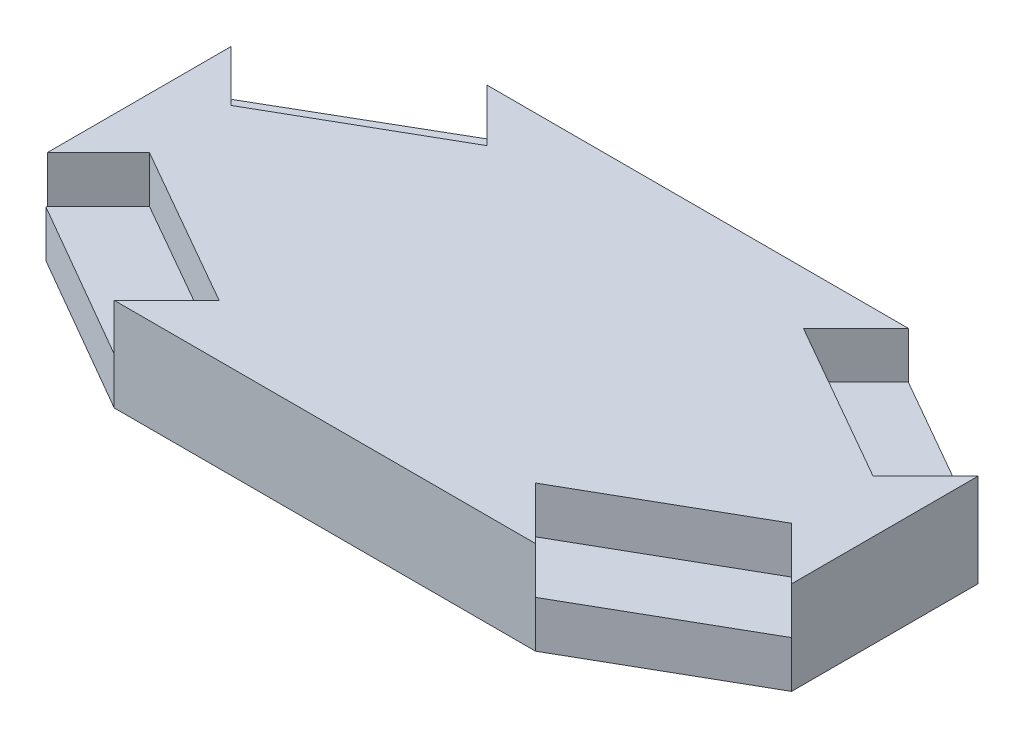
ISO-10303-21;
HEADER;
FILE_DESCRIPTION(('STEP AP214'),'2;1');
FILE_NAME('part.step','',(''),(''),'','','');
FILE_SCHEMA(('AUTOMOTIVE_DESIGN { 1 0 10303 214 1 1 1 1 }'));
ENDSEC;
DATA;
#1=APPLICATION_CONTEXT('core data for automotive mechanical design processes');
#2=APPLICATION_PROTOCOL_DEFINITION('international standard','automotive_design',2000,#1);
#3=PRODUCT_CONTEXT('',#1,'mechanical');
#4=PRODUCT('Part','Part','',(#3));
#5=PRODUCT_RELATED_PRODUCT_CATEGORY('part','',(#4));
#6=PRODUCT_DEFINITION_FORMATION('','',#4);
#7=PRODUCT_DEFINITION_CONTEXT('part definition',#1,'design');
#8=PRODUCT_DEFINITION('design','',#6,#7);
#9=PRODUCT_DEFINITION_SHAPE('','',#8);
#10=(LENGTH_UNIT() NAMED_UNIT(*) SI_UNIT(.MILLI.,.METRE.));
#11=(NAMED_UNIT(*) PLANE_ANGLE_UNIT() SI_UNIT($,.RADIAN.));
#12=(NAMED_UNIT(*) SI_UNIT($,.STERADIAN.) SOLID_ANGLE_UNIT());
#13=UNCERTAINTY_MEASURE_WITH_UNIT(LENGTH_MEASURE(1.E-05),#10,'distance_accuracy_value','');
#14=(GEOMETRIC_REPRESENTATION_CONTEXT(3) GLOBAL_UNCERTAINTY_ASSIGNED_CONTEXT((#13)) GLOBAL_UNIT_ASSIGNED_CONTEXT((#10,
#11,#12)) REPRESENTATION_CONTEXT('',''));
#15=CARTESIAN_POINT('',(0.,0.,0.));
#16=DIRECTION('',(0.,0.,1.));
#17=DIRECTION('',(1.,0.,0.));
#18=AXIS2_PLACEMENT_3D('',#15,#16,#17);
#19=CARTESIAN_POINT('',(50.8,6.35,6.35));
#20=DIRECTION('',(-0.496577563962219,0.,-0.867992351907175));
#21=DIRECTION('',(-0.867992351907175,0.,0.496577563962219));
#22=AXIS2_PLACEMENT_3D('',#19,#20,#21);
#23=PLANE('',#22);
#24=DIRECTION('',(0.867992351907175,0.,-0.496577563962219));
#25=VECTOR('',#24,1.);
#26=CARTESIAN_POINT('',(39.7005226280624,3.175,12.7));
#27=LINE('',#26,#25);
#28=CARTESIAN_POINT('',(39.7005226280624,3.175,12.7));
#29=VERTEX_POINT('',#28);
#30=CARTESIAN_POINT('',(50.8,3.175,6.35));
#31=VERTEX_POINT('',#30);
#32=EDGE_CURVE('E257',#29,#31,#27,.T.);
#33=ORIENTED_EDGE('',*,*,#32,.F.);
#34=DIRECTION('',(0.,-1.,0.));
#35=VECTOR('',#34,1.);
#36=CARTESIAN_POINT('',(39.7005226280624,6.35,12.7));
#37=LINE('',#36,#35);
#38=CARTESIAN_POINT('',(39.7005226280624,0.,12.7));
#39=VERTEX_POINT('',#38);
#40=EDGE_CURVE('E345',#29,#39,#37,.T.);
#41=ORIENTED_EDGE('',*,*,#40,.T.);
#42=DIRECTION('',(0.867992351907175,0.,-0.496577563962219));
#43=VECTOR('',#42,1.);
#44=CARTESIAN_POINT('',(50.8,0.,6.35));
#45=LINE('',#44,#43);
#46=CARTESIAN_POINT('',(50.8,0.,6.35));
#47=VERTEX_POINT('',#46);
#48=EDGE_CURVE('E303',#39,#47,#45,.T.);
#49=ORIENTED_EDGE('',*,*,#48,.T.);
#50=DIRECTION('',(0.,-1.,0.));
#51=VECTOR('',#50,1.);
#52=CARTESIAN_POINT('',(50.8,6.35,6.35));
#53=LINE('',#52,#51);
#54=EDGE_CURVE('E336',#31,#47,#53,.T.);
#55=ORIENTED_EDGE('',*,*,#54,.F.);
#56=EDGE_LOOP('',(#33,#41,#49,#55));
#57=FACE_BOUND('',#56,.T.);
#58=ADVANCED_FACE('F39',(#57),#23,.F.);
#59=CARTESIAN_POINT('',(50.8,6.35,-6.35));
#60=DIRECTION('',(-0.496577563962219,0.,0.867992351907175));
#61=DIRECTION('',(0.867992351907175,0.,0.496577563962219));
#62=AXIS2_PLACEMENT_3D('',#59,#60,#61);
#63=PLANE('',#62);
#64=DIRECTION('',(-0.867992351907175,0.,-0.496577563962219));
#65=VECTOR('',#64,1.);
#66=CARTESIAN_POINT('',(39.7005226280624,3.175,-12.7));
#67=LINE('',#66,#65);
#68=CARTESIAN_POINT('',(50.8,3.175,-6.35));
#69=VERTEX_POINT('',#68);
#70=CARTESIAN_POINT('',(39.7005226280624,3.175,-12.7));
#71=VERTEX_POINT('',#70);
#72=EDGE_CURVE('E241',#69,#71,#67,.T.);
#73=ORIENTED_EDGE('',*,*,#72,.F.);
#74=DIRECTION('',(0.,-1.,0.));
#75=VECTOR('',#74,1.);
#76=CARTESIAN_POINT('',(50.8,6.35,-6.35));
#77=LINE('',#76,#75);
#78=CARTESIAN_POINT('',(50.8,0.,-6.35));
#79=VERTEX_POINT('',#78);
#80=EDGE_CURVE('E333',#69,#79,#77,.T.);
#81=ORIENTED_EDGE('',*,*,#80,.T.);
#82=DIRECTION('',(-0.867992351907175,0.,-0.496577563962219));
#83=VECTOR('',#82,1.);
#84=CARTESIAN_POINT('',(50.8,0.,-6.35));
#85=LINE('',#84,#83);
#86=CARTESIAN_POINT('',(39.7005226280624,0.,-12.7));
#87=VERTEX_POINT('',#86);
#88=EDGE_CURVE('E307',#79,#87,#85,.T.);
#89=ORIENTED_EDGE('',*,*,#88,.T.);
#90=DIRECTION('',(0.,-1.,0.));
#91=VECTOR('',#90,1.);
#92=CARTESIAN_POINT('',(39.7005226280624,6.35,-12.7));
#93=LINE('',#92,#91);
#94=EDGE_CURVE('E332',#71,#87,#93,.T.);
#95=ORIENTED_EDGE('',*,*,#94,.F.);
#96=EDGE_LOOP('',(#73,#81,#89,#95));
#97=FACE_BOUND('',#96,.T.);
#98=ADVANCED_FACE('F413',(#97),#63,.F.);
#99=CARTESIAN_POINT('',(0.,6.35,0.));
#100=DIRECTION('',(0.,-1.,0.));
#101=DIRECTION('',(0.,0.,-1.));
#102=AXIS2_PLACEMENT_3D('',#99,#100,#101);
#103=PLANE('',#102);
#104=DIRECTION('',(0.707106781186554,0.,-0.707106781186541));
#105=VECTOR('',#104,1.);
#106=CARTESIAN_POINT('',(10.9985226280624,6.35,12.7));
#107=LINE('',#106,#105);
#108=CARTESIAN_POINT('',(10.9985226280624,6.35,12.7));
#109=VERTEX_POINT('',#108);
#110=CARTESIAN_POINT('',(14.5711522720684,6.35,9.127370355994));
#111=VERTEX_POINT('',#110);
#112=EDGE_CURVE('E53',#109,#111,#107,.T.);
#113=ORIENTED_EDGE('',*,*,#112,.F.);
#114=DIRECTION('',(1.,0.,0.));
#115=VECTOR('',#114,1.);
#116=CARTESIAN_POINT('',(39.7005226280624,6.35,12.7));
#117=LINE('',#116,#115);
#118=CARTESIAN_POINT('',(39.7005226280624,6.35,12.7));
#119=VERTEX_POINT('',#118);
#120=EDGE_CURVE('E290',#109,#119,#117,.T.);
#121=ORIENTED_EDGE('',*,*,#120,.T.);
#122=DIRECTION('',(0.707106781186552,0.,0.707106781186543));
#123=VECTOR('',#122,1.);
#124=CARTESIAN_POINT('',(39.7005226280624,6.35,12.7));
#125=LINE('',#124,#123);
#126=CARTESIAN_POINT('',(36.1278929840563,6.35,9.127370355994));
#127=VERTEX_POINT('',#126);
#128=EDGE_CURVE('E229',#127,#119,#125,.T.);
#129=ORIENTED_EDGE('',*,*,#128,.F.);
#130=DIRECTION('',(-0.867992351907175,0.,0.496577563962219));
#131=VECTOR('',#130,1.);
#132=CARTESIAN_POINT('',(36.1278929840563,6.35,9.127370355994));
#133=LINE('',#132,#131);
#134=CARTESIAN_POINT('',(47.227370355994,6.35,2.777370355994));
#135=VERTEX_POINT('',#134);
#136=EDGE_CURVE('E261',#135,#127,#133,.T.);
#137=ORIENTED_EDGE('',*,*,#136,.F.);
#138=DIRECTION('',(-0.707106781186551,0.,-0.707106781186544));
#139=VECTOR('',#138,1.);
#140=CARTESIAN_POINT('',(50.8,6.35,6.35));
#141=LINE('',#140,#139);
#142=CARTESIAN_POINT('',(50.8,6.35,6.35));
#143=VERTEX_POINT('',#142);
#144=EDGE_CURVE('E275',#143,#135,#141,.T.);
#145=ORIENTED_EDGE('',*,*,#144,.F.);
#146=DIRECTION('',(0.,0.,-1.));
#147=VECTOR('',#146,1.);
#148=CARTESIAN_POINT('',(50.8,6.35,-6.35));
#149=LINE('',#148,#147);
#150=CARTESIAN_POINT('',(50.8,6.35,-6.35));
#151=VERTEX_POINT('',#150);
#152=EDGE_CURVE('E289',#143,#151,#149,.T.);
#153=ORIENTED_EDGE('',*,*,#152,.T.);
#154=DIRECTION('',(0.707106781186549,0.,-0.707106781186546));
#155=VECTOR('',#154,1.);
#156=CARTESIAN_POINT('',(50.8,6.35,-6.35));
#157=LINE('',#156,#155);
#158=CARTESIAN_POINT('',(47.227370355994,6.35,-2.77737035599399));
#159=VERTEX_POINT('',#158);
#160=EDGE_CURVE('E238',#159,#151,#157,.T.);
#161=ORIENTED_EDGE('',*,*,#160,.F.);
#162=DIRECTION('',(0.867992351907175,0.,0.496577563962219));
#163=VECTOR('',#162,1.);
#164=CARTESIAN_POINT('',(36.1278929840563,6.35,-9.12737035599399));
#165=LINE('',#164,#163);
#166=CARTESIAN_POINT('',(36.1278929840563,6.35,-9.12737035599399));
#167=VERTEX_POINT('',#166);
#168=EDGE_CURVE('E245',#167,#159,#165,.T.);
#169=ORIENTED_EDGE('',*,*,#168,.F.);
#170=DIRECTION('',(-0.707106781186551,0.,0.707106781186544));
#171=VECTOR('',#170,1.);
#172=CARTESIAN_POINT('',(39.7005226280624,6.35,-12.7));
#173=LINE('',#172,#171);
#174=CARTESIAN_POINT('',(39.7005226280624,6.35,-12.7));
#175=VERTEX_POINT('',#174);
#176=EDGE_CURVE('E65',#175,#167,#173,.T.);
#177=ORIENTED_EDGE('',*,*,#176,.F.);
#178=DIRECTION('',(-1.,0.,0.));
#179=VECTOR('',#178,1.);
#180=CARTESIAN_POINT('',(39.7005226280624,6.35,-12.7));
#181=LINE('',#180,#179);
#182=CARTESIAN_POINT('',(10.9985226280624,6.35,-12.7));
#183=VERTEX_POINT('',#182);
#184=EDGE_CURVE('E204',#175,#183,#181,.T.);
#185=ORIENTED_EDGE('',*,*,#184,.T.);
#186=DIRECTION('',(-0.707106781186554,0.,-0.707106781186541));
#187=VECTOR('',#186,1.);
#188=CARTESIAN_POINT('',(10.9985226280624,6.35,-12.7));
#189=LINE('',#188,#187);
#190=CARTESIAN_POINT('',(14.5711522720684,6.35,-9.127370355994));
#191=VERTEX_POINT('',#190);
#192=EDGE_CURVE('E183',#191,#183,#189,.T.);
#193=ORIENTED_EDGE('',*,*,#192,.F.);
#194=DIRECTION('',(0.867992351907175,0.,-0.496577563962219));
#195=VECTOR('',#194,1.);
#196=CARTESIAN_POINT('',(14.5711522720684,6.35,-9.127370355994));
#197=LINE('',#196,#195);
#198=CARTESIAN_POINT('',(3.47167490013077,6.35,-2.77737035599399));
#199=VERTEX_POINT('',#198);
#200=EDGE_CURVE('E194',#199,#191,#197,.T.);
#201=ORIENTED_EDGE('',*,*,#200,.F.);
#202=DIRECTION('',(0.707106781186552,0.,0.707106781186543));
#203=VECTOR('',#202,1.);
#204=CARTESIAN_POINT('',(-0.100954743875267,6.35,-6.34999999999999));
#205=LINE('',#204,#203);
#206=CARTESIAN_POINT('',(0.,6.35,-6.24904525612472));
#207=VERTEX_POINT('',#206);
#208=EDGE_CURVE('E215',#207,#199,#205,.T.);
#209=ORIENTED_EDGE('',*,*,#208,.F.);
#210=DIRECTION('',(0.,0.,1.));
#211=VECTOR('',#210,1.);
#212=CARTESIAN_POINT('',(0.,6.35,6.35));
#213=LINE('',#212,#211);
#214=CARTESIAN_POINT('',(0.,6.35,6.24904525612472));
#215=VERTEX_POINT('',#214);
#216=EDGE_CURVE('E293',#207,#215,#213,.T.);
#217=ORIENTED_EDGE('',*,*,#216,.T.);
#218=DIRECTION('',(-0.707106781186552,0.,0.707106781186543));
#219=VECTOR('',#218,1.);
#220=CARTESIAN_POINT('',(-0.100954743875267,6.35,6.34999999999999));
#221=LINE('',#220,#219);
#222=CARTESIAN_POINT('',(3.47167490013077,6.35,2.77737035599399));
#223=VERTEX_POINT('',#222);
#224=EDGE_CURVE('E224',#223,#215,#221,.T.);
#225=ORIENTED_EDGE('',*,*,#224,.F.);
#226=DIRECTION('',(-0.867992351907175,0.,-0.496577563962219));
#227=VECTOR('',#226,1.);
#228=CARTESIAN_POINT('',(14.5711522720684,6.35,9.127370355994));
#229=LINE('',#228,#227);
#230=EDGE_CURVE('E223',#111,#223,#229,.T.);
#231=ORIENTED_EDGE('',*,*,#230,.F.);
#232=EDGE_LOOP('',(#113,#121,#129,#137,#145,#153,#161,#169,#177,#185,#193,#201,#209,#217,#225,#231));
#233=FACE_BOUND('',#232,.T.);
#234=ADVANCED_FACE('F205',(#233),#103,.F.);
#235=CARTESIAN_POINT('',(39.7005226280624,6.35,12.7));
#236=DIRECTION('',(0.,0.,-1.));
#237=DIRECTION('',(-1.,0.,0.));
#238=AXIS2_PLACEMENT_3D('',#235,#236,#237);
#239=PLANE('',#238);
#240=DIRECTION('',(1.,0.,0.));
#241=VECTOR('',#240,1.);
#242=CARTESIAN_POINT('',(39.7005226280624,0.,12.7));
#243=LINE('',#242,#241);
#244=CARTESIAN_POINT('',(10.9985226280624,0.,12.7));
#245=VERTEX_POINT('',#244);
#246=EDGE_CURVE('E288',#245,#39,#243,.T.);
#247=ORIENTED_EDGE('',*,*,#246,.T.);
#248=ORIENTED_EDGE('',*,*,#40,.F.);
#249=EDGE_CURVE('E341',#119,#29,#37,.T.);
#250=ORIENTED_EDGE('',*,*,#249,.F.);
#251=ORIENTED_EDGE('',*,*,#120,.F.);
#252=DIRECTION('',(0.,-1.,0.));
#253=VECTOR('',#252,1.);
#254=CARTESIAN_POINT('',(10.9985226280624,6.35,12.7));
#255=LINE('',#254,#253);
#256=CARTESIAN_POINT('',(10.9985226280624,3.175,12.7));
#257=VERTEX_POINT('',#256);
#258=EDGE_CURVE('E321',#109,#257,#255,.T.);
#259=ORIENTED_EDGE('',*,*,#258,.T.);
#260=EDGE_CURVE('E296',#257,#245,#255,.T.);
#261=ORIENTED_EDGE('',*,*,#260,.T.);
#262=EDGE_LOOP('',(#247,#248,#250,#251,#259,#261));
#263=FACE_BOUND('',#262,.T.);
#264=ADVANCED_FACE('F41',(#263),#239,.F.);
#265=CARTESIAN_POINT('',(50.8,6.35,-6.35));
#266=DIRECTION('',(-1.,0.,0.));
#267=DIRECTION('',(0.,0.,1.));
#268=AXIS2_PLACEMENT_3D('',#265,#266,#267);
#269=PLANE('',#268);
#270=DIRECTION('',(0.,0.,-1.));
#271=VECTOR('',#270,1.);
#272=CARTESIAN_POINT('',(50.8,0.,-6.35));
#273=LINE('',#272,#271);
#274=EDGE_CURVE('E302',#47,#79,#273,.T.);
#275=ORIENTED_EDGE('',*,*,#274,.T.);
#276=ORIENTED_EDGE('',*,*,#80,.F.);
#277=EDGE_CURVE('E338',#151,#69,#77,.T.);
#278=ORIENTED_EDGE('',*,*,#277,.F.);
#279=ORIENTED_EDGE('',*,*,#152,.F.);
#280=EDGE_CURVE('E337',#143,#31,#53,.T.);
#281=ORIENTED_EDGE('',*,*,#280,.T.);
#282=ORIENTED_EDGE('',*,*,#54,.T.);
#283=EDGE_LOOP('',(#275,#276,#278,#279,#281,#282));
#284=FACE_BOUND('',#283,.T.);
#285=ADVANCED_FACE('F395',(#284),#269,.F.);
#286=CARTESIAN_POINT('',(39.7005226280624,6.35,-12.7));
#287=DIRECTION('',(0.,0.,1.));
#288=DIRECTION('',(1.,0.,0.));
#289=AXIS2_PLACEMENT_3D('',#286,#287,#288);
#290=PLANE('',#289);
#291=DIRECTION('',(-1.,0.,0.));
#292=VECTOR('',#291,1.);
#293=CARTESIAN_POINT('',(39.7005226280624,0.,-12.7));
#294=LINE('',#293,#292);
#295=CARTESIAN_POINT('',(10.9985226280624,0.,-12.7));
#296=VERTEX_POINT('',#295);
#297=EDGE_CURVE('E309',#87,#296,#294,.T.);
#298=ORIENTED_EDGE('',*,*,#297,.T.);
#299=DIRECTION('',(0.,-1.,0.));
#300=VECTOR('',#299,1.);
#301=CARTESIAN_POINT('',(10.9985226280624,6.35,-12.7));
#302=LINE('',#301,#300);
#303=CARTESIAN_POINT('',(10.9985226280624,3.175,-12.7));
#304=VERTEX_POINT('',#303);
#305=EDGE_CURVE('E327',#304,#296,#302,.T.);
#306=ORIENTED_EDGE('',*,*,#305,.F.);
#307=EDGE_CURVE('E328',#183,#304,#302,.T.);
#308=ORIENTED_EDGE('',*,*,#307,.F.);
#309=ORIENTED_EDGE('',*,*,#184,.F.);
#310=EDGE_CURVE('E335',#175,#71,#93,.T.);
#311=ORIENTED_EDGE('',*,*,#310,.T.);
#312=ORIENTED_EDGE('',*,*,#94,.T.);
#313=EDGE_LOOP('',(#298,#306,#308,#309,#311,#312));
#314=FACE_BOUND('',#313,.T.);
#315=ADVANCED_FACE('F419',(#314),#290,.F.);
#316=CARTESIAN_POINT('',(10.9985226280624,6.35,-12.7));
#317=DIRECTION('',(0.5,0.,0.866025403784438));
#318=DIRECTION('',(0.866025403784439,0.,-0.5));
#319=AXIS2_PLACEMENT_3D('',#316,#317,#318);
#320=PLANE('',#319);
#321=DIRECTION('',(0.,-1.,0.));
#322=VECTOR('',#321,1.);
#323=CARTESIAN_POINT('',(0.,6.35,-6.35));
#324=LINE('',#323,#322);
#325=CARTESIAN_POINT('',(0.,3.175,-6.35));
#326=VERTEX_POINT('',#325);
#327=CARTESIAN_POINT('',(0.,0.,-6.35));
#328=VERTEX_POINT('',#327);
#329=EDGE_CURVE('E326',#326,#328,#324,.T.);
#330=ORIENTED_EDGE('',*,*,#329,.F.);
#331=DIRECTION('',(0.866025403784439,0.,-0.5));
#332=VECTOR('',#331,1.);
#333=CARTESIAN_POINT('',(10.9985226280624,3.175,-12.7));
#334=LINE('',#333,#332);
#335=EDGE_CURVE('E281',#326,#304,#334,.T.);
#336=ORIENTED_EDGE('',*,*,#335,.T.);
#337=ORIENTED_EDGE('',*,*,#305,.T.);
#338=DIRECTION('',(-0.866025403784438,0.,0.5));
#339=VECTOR('',#338,1.);
#340=CARTESIAN_POINT('',(10.9985226280624,0.,-12.7));
#341=LINE('',#340,#339);
#342=EDGE_CURVE('E311',#296,#328,#341,.T.);
#343=ORIENTED_EDGE('',*,*,#342,.T.);
#344=EDGE_LOOP('',(#330,#336,#337,#343));
#345=FACE_BOUND('',#344,.T.);
#346=ADVANCED_FACE('F424',(#345),#320,.F.);
#347=CARTESIAN_POINT('',(0.,6.35,6.35));
#348=DIRECTION('',(1.,0.,0.));
#349=DIRECTION('',(0.,0.,-1.));
#350=AXIS2_PLACEMENT_3D('',#347,#348,#349);
#351=PLANE('',#350);
#352=DIRECTION('',(0.,0.,-1.));
#353=VECTOR('',#352,1.);
#354=CARTESIAN_POINT('',(0.,3.175,6.35));
#355=LINE('',#354,#353);
#356=CARTESIAN_POINT('',(0.,3.175,6.35));
#357=VERTEX_POINT('',#356);
#358=CARTESIAN_POINT('',(0.,3.175,6.24904525612472));
#359=VERTEX_POINT('',#358);
#360=EDGE_CURVE('E279',#357,#359,#355,.T.);
#361=ORIENTED_EDGE('',*,*,#360,.T.);
#362=DIRECTION('',(0.,1.,0.));
#363=VECTOR('',#362,1.);
#364=CARTESIAN_POINT('',(0.,6.35,6.24904525612472));
#365=LINE('',#364,#363);
#366=EDGE_CURVE('E11',#359,#215,#365,.T.);
#367=ORIENTED_EDGE('',*,*,#366,.T.);
#368=ORIENTED_EDGE('',*,*,#216,.F.);
#369=DIRECTION('',(0.,-1.,0.));
#370=VECTOR('',#369,1.);
#371=CARTESIAN_POINT('',(0.,6.35,-6.24904525612472));
#372=LINE('',#371,#370);
#373=CARTESIAN_POINT('',(0.,3.175,-6.24904525612472));
#374=VERTEX_POINT('',#373);
#375=EDGE_CURVE('E50',#207,#374,#372,.T.);
#376=ORIENTED_EDGE('',*,*,#375,.T.);
#377=DIRECTION('',(0.,0.,-1.));
#378=VECTOR('',#377,1.);
#379=CARTESIAN_POINT('',(0.,3.175,6.35));
#380=LINE('',#379,#378);
#381=EDGE_CURVE('E346',#374,#326,#380,.T.);
#382=ORIENTED_EDGE('',*,*,#381,.T.);
#383=ORIENTED_EDGE('',*,*,#329,.T.);
#384=DIRECTION('',(0.,0.,1.));
#385=VECTOR('',#384,1.);
#386=CARTESIAN_POINT('',(0.,0.,6.35));
#387=LINE('',#386,#385);
#388=CARTESIAN_POINT('',(0.,0.,6.35));
#389=VERTEX_POINT('',#388);
#390=EDGE_CURVE('E316',#328,#389,#387,.T.);
#391=ORIENTED_EDGE('',*,*,#390,.T.);
#392=DIRECTION('',(0.,-1.,0.));
#393=VECTOR('',#392,1.);
#394=CARTESIAN_POINT('',(0.,6.35,6.35));
#395=LINE('',#394,#393);
#396=EDGE_CURVE('E322',#357,#389,#395,.T.);
#397=ORIENTED_EDGE('',*,*,#396,.F.);
#398=EDGE_LOOP('',(#361,#367,#368,#376,#382,#383,#391,#397));
#399=FACE_BOUND('',#398,.T.);
#400=ADVANCED_FACE('F351',(#399),#351,.F.);
#401=CARTESIAN_POINT('',(10.9985226280624,6.35,12.7));
#402=DIRECTION('',(0.5,0.,-0.866025403784438));
#403=DIRECTION('',(-0.866025403784439,0.,-0.5));
#404=AXIS2_PLACEMENT_3D('',#401,#402,#403);
#405=PLANE('',#404);
#406=ORIENTED_EDGE('',*,*,#260,.F.);
#407=DIRECTION('',(-0.866025403784439,0.,-0.5));
#408=VECTOR('',#407,1.);
#409=CARTESIAN_POINT('',(10.9985226280624,3.175,12.7));
#410=LINE('',#409,#408);
#411=EDGE_CURVE('E344',#257,#357,#410,.T.);
#412=ORIENTED_EDGE('',*,*,#411,.T.);
#413=ORIENTED_EDGE('',*,*,#396,.T.);
#414=DIRECTION('',(0.866025403784438,0.,0.5));
#415=VECTOR('',#414,1.);
#416=CARTESIAN_POINT('',(10.9985226280624,0.,12.7));
#417=LINE('',#416,#415);
#418=EDGE_CURVE('E292',#389,#245,#417,.T.);
#419=ORIENTED_EDGE('',*,*,#418,.T.);
#420=EDGE_LOOP('',(#406,#412,#413,#419));
#421=FACE_BOUND('',#420,.T.);
#422=ADVANCED_FACE('F369',(#421),#405,.F.);
#423=CARTESIAN_POINT('',(0.,0.,0.));
#424=DIRECTION('',(0.,-1.,0.));
#425=DIRECTION('',(0.,0.,-1.));
#426=AXIS2_PLACEMENT_3D('',#423,#424,#425);
#427=PLANE('',#426);
#428=ORIENTED_EDGE('',*,*,#246,.F.);
#429=ORIENTED_EDGE('',*,*,#418,.F.);
#430=ORIENTED_EDGE('',*,*,#390,.F.);
#431=ORIENTED_EDGE('',*,*,#342,.F.);
#432=ORIENTED_EDGE('',*,*,#297,.F.);
#433=ORIENTED_EDGE('',*,*,#88,.F.);
#434=ORIENTED_EDGE('',*,*,#274,.F.);
#435=ORIENTED_EDGE('',*,*,#48,.F.);
#436=EDGE_LOOP('',(#428,#429,#430,#431,#432,#433,#434,#435));
#437=FACE_BOUND('',#436,.T.);
#438=ADVANCED_FACE('F410',(#437),#427,.T.);
#439=CARTESIAN_POINT('',(39.7005226280624,3.175,12.7));
#440=DIRECTION('',(-0.707106781186543,0.,0.707106781186552));
#441=DIRECTION('',(0.707106781186552,0.,0.707106781186543));
#442=AXIS2_PLACEMENT_3D('',#439,#440,#441);
#443=PLANE('',#442);
#444=ORIENTED_EDGE('',*,*,#128,.T.);
#445=ORIENTED_EDGE('',*,*,#249,.T.);
#446=DIRECTION('',(0.707106781186552,0.,0.707106781186543));
#447=VECTOR('',#446,1.);
#448=CARTESIAN_POINT('',(39.7005226280624,3.175,12.7));
#449=LINE('',#448,#447);
#450=CARTESIAN_POINT('',(36.1278929840563,3.175,9.127370355994));
#451=VERTEX_POINT('',#450);
#452=EDGE_CURVE('E260',#451,#29,#449,.T.);
#453=ORIENTED_EDGE('',*,*,#452,.F.);
#454=DIRECTION('',(0.,1.,0.));
#455=VECTOR('',#454,1.);
#456=CARTESIAN_POINT('',(36.1278929840563,3.175,9.127370355994));
#457=LINE('',#456,#455);
#458=EDGE_CURVE('E277',#451,#127,#457,.T.);
#459=ORIENTED_EDGE('',*,*,#458,.T.);
#460=EDGE_LOOP('',(#444,#445,#453,#459));
#461=FACE_BOUND('',#460,.T.);
#462=ADVANCED_FACE('F381',(#461),#443,.F.);
#463=CARTESIAN_POINT('',(36.1278929840563,3.175,9.127370355994));
#464=DIRECTION('',(-0.496577563962219,0.,-0.867992351907175));
#465=DIRECTION('',(-0.867992351907175,0.,0.496577563962219));
#466=AXIS2_PLACEMENT_3D('',#463,#464,#465);
#467=PLANE('',#466);
#468=ORIENTED_EDGE('',*,*,#136,.T.);
#469=ORIENTED_EDGE('',*,*,#458,.F.);
#470=DIRECTION('',(-0.867992351907175,0.,0.496577563962219));
#471=VECTOR('',#470,1.);
#472=CARTESIAN_POINT('',(36.1278929840563,3.175,9.127370355994));
#473=LINE('',#472,#471);
#474=CARTESIAN_POINT('',(47.227370355994,3.175,2.777370355994));
#475=VERTEX_POINT('',#474);
#476=EDGE_CURVE('E270',#475,#451,#473,.T.);
#477=ORIENTED_EDGE('',*,*,#476,.F.);
#478=DIRECTION('',(0.,1.,0.));
#479=VECTOR('',#478,1.);
#480=CARTESIAN_POINT('',(47.227370355994,3.175,2.777370355994));
#481=LINE('',#480,#479);
#482=EDGE_CURVE('E269',#475,#135,#481,.T.);
#483=ORIENTED_EDGE('',*,*,#482,.T.);
#484=EDGE_LOOP('',(#468,#469,#477,#483));
#485=FACE_BOUND('',#484,.T.);
#486=ADVANCED_FACE('F397',(#485),#467,.F.);
#487=CARTESIAN_POINT('',(50.8,3.175,6.35));
#488=DIRECTION('',(0.707106781186543,0.,-0.707106781186551));
#489=DIRECTION('',(-0.707106781186551,0.,-0.707106781186544));
#490=AXIS2_PLACEMENT_3D('',#487,#488,#489);
#491=PLANE('',#490);
#492=ORIENTED_EDGE('',*,*,#144,.T.);
#493=ORIENTED_EDGE('',*,*,#482,.F.);
#494=DIRECTION('',(-0.707106781186551,0.,-0.707106781186544));
#495=VECTOR('',#494,1.);
#496=CARTESIAN_POINT('',(50.8,3.175,6.35));
#497=LINE('',#496,#495);
#498=EDGE_CURVE('E262',#31,#475,#497,.T.);
#499=ORIENTED_EDGE('',*,*,#498,.F.);
#500=ORIENTED_EDGE('',*,*,#280,.F.);
#501=EDGE_LOOP('',(#492,#493,#499,#500));
#502=FACE_BOUND('',#501,.T.);
#503=ADVANCED_FACE('F398',(#502),#491,.F.);
#504=CARTESIAN_POINT('',(0.,3.175,0.));
#505=DIRECTION('',(0.,-1.,0.));
#506=DIRECTION('',(0.,0.,-1.));
#507=AXIS2_PLACEMENT_3D('',#504,#505,#506);
#508=PLANE('',#507);
#509=ORIENTED_EDGE('',*,*,#452,.T.);
#510=ORIENTED_EDGE('',*,*,#32,.T.);
#511=ORIENTED_EDGE('',*,*,#498,.T.);
#512=ORIENTED_EDGE('',*,*,#476,.T.);
#513=EDGE_LOOP('',(#509,#510,#511,#512));
#514=FACE_BOUND('',#513,.T.);
#515=ADVANCED_FACE('F383',(#514),#508,.F.);
#516=CARTESIAN_POINT('',(-0.100954743875267,3.175,-6.34999999999999));
#517=DIRECTION('',(-0.707106781186543,0.,0.707106781186552));
#518=DIRECTION('',(0.707106781186552,0.,0.707106781186543));
#519=AXIS2_PLACEMENT_3D('',#516,#517,#518);
#520=PLANE('',#519);
#521=ORIENTED_EDGE('',*,*,#208,.T.);
#522=DIRECTION('',(0.,1.,0.));
#523=VECTOR('',#522,1.);
#524=CARTESIAN_POINT('',(3.47167490013077,3.175,-2.77737035599399));
#525=LINE('',#524,#523);
#526=CARTESIAN_POINT('',(3.47167490013077,3.175,-2.77737035599399));
#527=VERTEX_POINT('',#526);
#528=EDGE_CURVE('E195',#527,#199,#525,.T.);
#529=ORIENTED_EDGE('',*,*,#528,.F.);
#530=DIRECTION('',(0.707106781186552,0.,0.707106781186543));
#531=VECTOR('',#530,1.);
#532=CARTESIAN_POINT('',(-0.100954743875267,3.175,-6.34999999999999));
#533=LINE('',#532,#531);
#534=EDGE_CURVE('E214',#374,#527,#533,.T.);
#535=ORIENTED_EDGE('',*,*,#534,.F.);
#536=ORIENTED_EDGE('',*,*,#375,.F.);
#537=EDGE_LOOP('',(#521,#529,#535,#536));
#538=FACE_BOUND('',#537,.T.);
#539=ADVANCED_FACE('F360',(#538),#520,.F.);
#540=CARTESIAN_POINT('',(0.,3.175,0.));
#541=DIRECTION('',(0.,-1.,0.));
#542=DIRECTION('',(0.,0.,-1.));
#543=AXIS2_PLACEMENT_3D('',#540,#541,#542);
#544=PLANE('',#543);
#545=ORIENTED_EDGE('',*,*,#381,.F.);
#546=ORIENTED_EDGE('',*,*,#534,.T.);
#547=DIRECTION('',(0.867992351907175,0.,-0.496577563962219));
#548=VECTOR('',#547,1.);
#549=CARTESIAN_POINT('',(14.5711522720684,3.175,-9.127370355994));
#550=LINE('',#549,#548);
#551=CARTESIAN_POINT('',(14.5711522720684,3.175,-9.127370355994));
#552=VERTEX_POINT('',#551);
#553=EDGE_CURVE('E213',#527,#552,#550,.T.);
#554=ORIENTED_EDGE('',*,*,#553,.T.);
#555=DIRECTION('',(-0.707106781186554,0.,-0.707106781186541));
#556=VECTOR('',#555,1.);
#557=CARTESIAN_POINT('',(10.9985226280624,3.175,-12.7));
#558=LINE('',#557,#556);
#559=EDGE_CURVE('E186',#552,#304,#558,.T.);
#560=ORIENTED_EDGE('',*,*,#559,.T.);
#561=ORIENTED_EDGE('',*,*,#335,.F.);
#562=EDGE_LOOP('',(#545,#546,#554,#560,#561));
#563=FACE_BOUND('',#562,.T.);
#564=ADVANCED_FACE('F501',(#563),#544,.F.);
#565=CARTESIAN_POINT('',(10.9985226280624,3.175,-12.7));
#566=DIRECTION('',(0.707106781186541,0.,-0.707106781186554));
#567=DIRECTION('',(-0.707106781186554,0.,-0.707106781186541));
#568=AXIS2_PLACEMENT_3D('',#565,#566,#567);
#569=PLANE('',#568);
#570=ORIENTED_EDGE('',*,*,#192,.T.);
#571=ORIENTED_EDGE('',*,*,#307,.T.);
#572=ORIENTED_EDGE('',*,*,#559,.F.);
#573=DIRECTION('',(0.,1.,0.));
#574=VECTOR('',#573,1.);
#575=CARTESIAN_POINT('',(14.5711522720684,3.175,-9.127370355994));
#576=LINE('',#575,#574);
#577=EDGE_CURVE('E182',#552,#191,#576,.T.);
#578=ORIENTED_EDGE('',*,*,#577,.T.);
#579=EDGE_LOOP('',(#570,#571,#572,#578));
#580=FACE_BOUND('',#579,.T.);
#581=ADVANCED_FACE('F181',(#580),#569,.F.);
#582=CARTESIAN_POINT('',(14.5711522720684,3.175,-9.127370355994));
#583=DIRECTION('',(0.496577563962219,0.,0.867992351907175));
#584=DIRECTION('',(0.867992351907175,0.,-0.496577563962219));
#585=AXIS2_PLACEMENT_3D('',#582,#583,#584);
#586=PLANE('',#585);
#587=ORIENTED_EDGE('',*,*,#200,.T.);
#588=ORIENTED_EDGE('',*,*,#577,.F.);
#589=ORIENTED_EDGE('',*,*,#553,.F.);
#590=ORIENTED_EDGE('',*,*,#528,.T.);
#591=EDGE_LOOP('',(#587,#588,#589,#590));
#592=FACE_BOUND('',#591,.T.);
#593=ADVANCED_FACE('F198',(#592),#586,.F.);
#594=CARTESIAN_POINT('',(50.8,3.175,-6.35));
#595=DIRECTION('',(0.707106781186546,0.,0.707106781186549));
#596=DIRECTION('',(0.707106781186549,0.,-0.707106781186546));
#597=AXIS2_PLACEMENT_3D('',#594,#595,#596);
#598=PLANE('',#597);
#599=ORIENTED_EDGE('',*,*,#160,.T.);
#600=ORIENTED_EDGE('',*,*,#277,.T.);
#601=DIRECTION('',(0.707106781186549,0.,-0.707106781186546));
#602=VECTOR('',#601,1.);
#603=CARTESIAN_POINT('',(50.8,3.175,-6.35));
#604=LINE('',#603,#602);
#605=CARTESIAN_POINT('',(47.227370355994,3.175,-2.77737035599399));
#606=VERTEX_POINT('',#605);
#607=EDGE_CURVE('E236',#606,#69,#604,.T.);
#608=ORIENTED_EDGE('',*,*,#607,.F.);
#609=DIRECTION('',(0.,1.,0.));
#610=VECTOR('',#609,1.);
#611=CARTESIAN_POINT('',(47.227370355994,3.175,-2.77737035599399));
#612=LINE('',#611,#610);
#613=EDGE_CURVE('E206',#606,#159,#612,.T.);
#614=ORIENTED_EDGE('',*,*,#613,.T.);
#615=EDGE_LOOP('',(#599,#600,#608,#614));
#616=FACE_BOUND('',#615,.T.);
#617=ADVANCED_FACE('F530',(#616),#598,.F.);
#618=CARTESIAN_POINT('',(36.1278929840563,3.175,-9.12737035599399));
#619=DIRECTION('',(-0.496577563962219,0.,0.867992351907175));
#620=DIRECTION('',(0.867992351907175,0.,0.496577563962219));
#621=AXIS2_PLACEMENT_3D('',#618,#619,#620);
#622=PLANE('',#621);
#623=ORIENTED_EDGE('',*,*,#168,.T.);
#624=ORIENTED_EDGE('',*,*,#613,.F.);
#625=DIRECTION('',(0.867992351907175,0.,0.496577563962219));
#626=VECTOR('',#625,1.);
#627=CARTESIAN_POINT('',(36.1278929840563,3.175,-9.12737035599399));
#628=LINE('',#627,#626);
#629=CARTESIAN_POINT('',(36.1278929840563,3.175,-9.12737035599399));
#630=VERTEX_POINT('',#629);
#631=EDGE_CURVE('E247',#630,#606,#628,.T.);
#632=ORIENTED_EDGE('',*,*,#631,.F.);
#633=DIRECTION('',(0.,1.,0.));
#634=VECTOR('',#633,1.);
#635=CARTESIAN_POINT('',(36.1278929840563,3.175,-9.12737035599399));
#636=LINE('',#635,#634);
#637=EDGE_CURVE('E208',#630,#167,#636,.T.);
#638=ORIENTED_EDGE('',*,*,#637,.T.);
#639=EDGE_LOOP('',(#623,#624,#632,#638));
#640=FACE_BOUND('',#639,.T.);
#641=ADVANCED_FACE('F538',(#640),#622,.F.);
#642=CARTESIAN_POINT('',(39.7005226280624,3.175,-12.7));
#643=DIRECTION('',(-0.707106781186544,0.,-0.707106781186551));
#644=DIRECTION('',(-0.707106781186551,0.,0.707106781186544));
#645=AXIS2_PLACEMENT_3D('',#642,#643,#644);
#646=PLANE('',#645);
#647=ORIENTED_EDGE('',*,*,#176,.T.);
#648=ORIENTED_EDGE('',*,*,#637,.F.);
#649=DIRECTION('',(-0.707106781186551,0.,0.707106781186544));
#650=VECTOR('',#649,1.);
#651=CARTESIAN_POINT('',(39.7005226280624,3.175,-12.7));
#652=LINE('',#651,#650);
#653=EDGE_CURVE('E252',#71,#630,#652,.T.);
#654=ORIENTED_EDGE('',*,*,#653,.F.);
#655=ORIENTED_EDGE('',*,*,#310,.F.);
#656=EDGE_LOOP('',(#647,#648,#654,#655));
#657=FACE_BOUND('',#656,.T.);
#658=ADVANCED_FACE('F547',(#657),#646,.F.);
#659=CARTESIAN_POINT('',(0.,3.175,0.));
#660=DIRECTION('',(0.,-1.,0.));
#661=DIRECTION('',(0.,0.,-1.));
#662=AXIS2_PLACEMENT_3D('',#659,#660,#661);
#663=PLANE('',#662);
#664=ORIENTED_EDGE('',*,*,#72,.T.);
#665=ORIENTED_EDGE('',*,*,#653,.T.);
#666=ORIENTED_EDGE('',*,*,#631,.T.);
#667=ORIENTED_EDGE('',*,*,#607,.T.);
#668=EDGE_LOOP('',(#664,#665,#666,#667));
#669=FACE_BOUND('',#668,.T.);
#670=ADVANCED_FACE('F556',(#669),#663,.F.);
#671=CARTESIAN_POINT('',(-0.100954743875267,3.175,6.34999999999999));
#672=DIRECTION('',(-0.707106781186543,0.,-0.707106781186552));
#673=DIRECTION('',(-0.707106781186552,0.,0.707106781186543));
#674=AXIS2_PLACEMENT_3D('',#671,#672,#673);
#675=PLANE('',#674);
#676=DIRECTION('',(-0.707106781186552,0.,0.707106781186543));
#677=VECTOR('',#676,1.);
#678=CARTESIAN_POINT('',(-0.100954743875267,3.175,6.34999999999999));
#679=LINE('',#678,#677);
#680=CARTESIAN_POINT('',(3.47167490013077,3.175,2.77737035599399));
#681=VERTEX_POINT('',#680);
#682=EDGE_CURVE('E219',#681,#359,#679,.T.);
#683=ORIENTED_EDGE('',*,*,#682,.F.);
#684=DIRECTION('',(0.,1.,0.));
#685=VECTOR('',#684,1.);
#686=CARTESIAN_POINT('',(3.47167490013077,3.175,2.77737035599399));
#687=LINE('',#686,#685);
#688=EDGE_CURVE('E222',#681,#223,#687,.T.);
#689=ORIENTED_EDGE('',*,*,#688,.T.);
#690=ORIENTED_EDGE('',*,*,#224,.T.);
#691=ORIENTED_EDGE('',*,*,#366,.F.);
#692=EDGE_LOOP('',(#683,#689,#690,#691));
#693=FACE_BOUND('',#692,.T.);
#694=ADVANCED_FACE('F362',(#693),#675,.F.);
#695=CARTESIAN_POINT('',(0.,3.175,0.));
#696=DIRECTION('',(0.,-1.,0.));
#697=DIRECTION('',(0.,0.,-1.));
#698=AXIS2_PLACEMENT_3D('',#695,#696,#697);
#699=PLANE('',#698);
#700=ORIENTED_EDGE('',*,*,#411,.F.);
#701=DIRECTION('',(0.707106781186554,0.,-0.707106781186541));
#702=VECTOR('',#701,1.);
#703=CARTESIAN_POINT('',(10.9985226280624,3.175,12.7));
#704=LINE('',#703,#702);
#705=CARTESIAN_POINT('',(14.5711522720684,3.175,9.127370355994));
#706=VERTEX_POINT('',#705);
#707=EDGE_CURVE('E228',#257,#706,#704,.T.);
#708=ORIENTED_EDGE('',*,*,#707,.T.);
#709=DIRECTION('',(-0.867992351907175,0.,-0.496577563962219));
#710=VECTOR('',#709,1.);
#711=CARTESIAN_POINT('',(14.5711522720684,3.175,9.127370355994));
#712=LINE('',#711,#710);
#713=EDGE_CURVE('E231',#706,#681,#712,.T.);
#714=ORIENTED_EDGE('',*,*,#713,.T.);
#715=ORIENTED_EDGE('',*,*,#682,.T.);
#716=ORIENTED_EDGE('',*,*,#360,.F.);
#717=EDGE_LOOP('',(#700,#708,#714,#715,#716));
#718=FACE_BOUND('',#717,.T.);
#719=ADVANCED_FACE('F364',(#718),#699,.F.);
#720=CARTESIAN_POINT('',(14.5711522720684,3.175,9.127370355994));
#721=DIRECTION('',(0.496577563962219,0.,-0.867992351907175));
#722=DIRECTION('',(-0.867992351907175,0.,-0.496577563962219));
#723=AXIS2_PLACEMENT_3D('',#720,#721,#722);
#724=PLANE('',#723);
#725=ORIENTED_EDGE('',*,*,#230,.T.);
#726=ORIENTED_EDGE('',*,*,#688,.F.);
#727=ORIENTED_EDGE('',*,*,#713,.F.);
#728=DIRECTION('',(0.,1.,0.));
#729=VECTOR('',#728,1.);
#730=CARTESIAN_POINT('',(14.5711522720684,3.175,9.127370355994));
#731=LINE('',#730,#729);
#732=EDGE_CURVE('E217',#706,#111,#731,.T.);
#733=ORIENTED_EDGE('',*,*,#732,.T.);
#734=EDGE_LOOP('',(#725,#726,#727,#733));
#735=FACE_BOUND('',#734,.T.);
#736=ADVANCED_FACE('F585',(#735),#724,.F.);
#737=CARTESIAN_POINT('',(10.9985226280624,3.175,12.7));
#738=DIRECTION('',(0.707106781186541,0.,0.707106781186554));
#739=DIRECTION('',(0.707106781186554,0.,-0.707106781186541));
#740=AXIS2_PLACEMENT_3D('',#737,#738,#739);
#741=PLANE('',#740);
#742=ORIENTED_EDGE('',*,*,#112,.T.);
#743=ORIENTED_EDGE('',*,*,#732,.F.);
#744=ORIENTED_EDGE('',*,*,#707,.F.);
#745=ORIENTED_EDGE('',*,*,#258,.F.);
#746=EDGE_LOOP('',(#742,#743,#744,#745));
#747=FACE_BOUND('',#746,.T.);
#748=ADVANCED_FACE('F374',(#747),#741,.F.);
#749=CLOSED_SHELL('',(#58,#98,#234,#264,#285,#315,#346,#400,#422,#438,#462,#486,#503,#515,#539,
#564,#581,#593,#617,#641,#658,#670,#694,#719,#736,#748));
#750=MANIFOLD_SOLID_BREP('B2',#749);
#751=ADVANCED_BREP_SHAPE_REPRESENTATION('',(#18,#750),#14);
#752=SHAPE_DEFINITION_REPRESENTATION(#9,#751);
ENDSEC;
END-ISO-10303-21;
